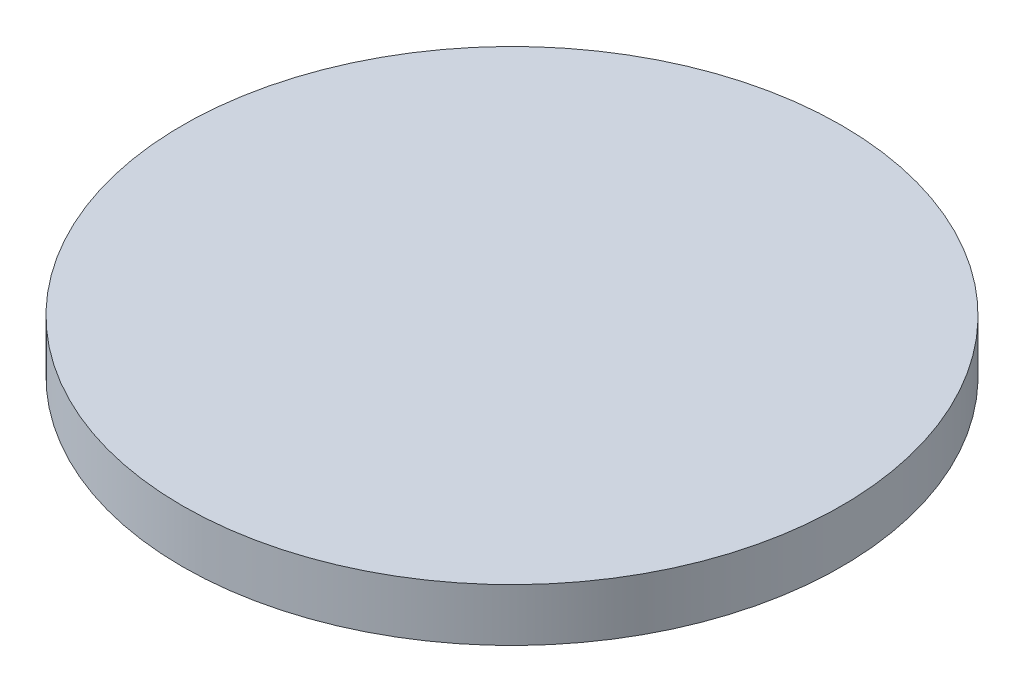
ISO-10303-21;
HEADER;
FILE_DESCRIPTION(('STEP AP214'),'2;1');
FILE_NAME('part.step','',(''),(''),'','','');
FILE_SCHEMA(('AUTOMOTIVE_DESIGN { 1 0 10303 214 1 1 1 1 }'));
ENDSEC;
DATA;
#1=APPLICATION_CONTEXT('core data for automotive mechanical design processes');
#2=APPLICATION_PROTOCOL_DEFINITION('international standard','automotive_design',2000,#1);
#3=PRODUCT_CONTEXT('',#1,'mechanical');
#4=PRODUCT('Part','Part','',(#3));
#5=PRODUCT_RELATED_PRODUCT_CATEGORY('part','',(#4));
#6=PRODUCT_DEFINITION_FORMATION('','',#4);
#7=PRODUCT_DEFINITION_CONTEXT('part definition',#1,'design');
#8=PRODUCT_DEFINITION('design','',#6,#7);
#9=PRODUCT_DEFINITION_SHAPE('','',#8);
#10=(LENGTH_UNIT() NAMED_UNIT(*) SI_UNIT(.MILLI.,.METRE.));
#11=(NAMED_UNIT(*) PLANE_ANGLE_UNIT() SI_UNIT($,.RADIAN.));
#12=(NAMED_UNIT(*) SI_UNIT($,.STERADIAN.) SOLID_ANGLE_UNIT());
#13=UNCERTAINTY_MEASURE_WITH_UNIT(LENGTH_MEASURE(1.E-05),#10,'distance_accuracy_value','');
#14=(GEOMETRIC_REPRESENTATION_CONTEXT(3) GLOBAL_UNCERTAINTY_ASSIGNED_CONTEXT((#13)) GLOBAL_UNIT_ASSIGNED_CONTEXT((#10,
#11,#12)) REPRESENTATION_CONTEXT('',''));
#15=CARTESIAN_POINT('',(0.,0.,0.));
#16=DIRECTION('',(0.,0.,1.));
#17=DIRECTION('',(1.,0.,0.));
#18=AXIS2_PLACEMENT_3D('',#15,#16,#17);
#19=CARTESIAN_POINT('',(0.,1.,0.));
#20=DIRECTION('',(0.,-1.,0.));
#21=DIRECTION('',(0.,0.,-1.));
#22=AXIS2_PLACEMENT_3D('',#19,#20,#21);
#23=CYLINDRICAL_SURFACE('',#22,6.25);
#24=CARTESIAN_POINT('',(0.,1.,0.));
#25=DIRECTION('',(0.,1.,0.));
#26=DIRECTION('',(0.,0.,1.));
#27=AXIS2_PLACEMENT_3D('',#24,#25,#26);
#28=CIRCLE('',#27,6.25);
#29=CARTESIAN_POINT('',(0.,1.,6.25));
#30=VERTEX_POINT('',#29);
#31=EDGE_CURVE('E10',#30,#30,#28,.T.);
#32=ORIENTED_EDGE('',*,*,#31,.F.);
#33=EDGE_LOOP('',(#32));
#34=FACE_BOUND('',#33,.T.);
#35=CARTESIAN_POINT('',(0.,0.,0.));
#36=DIRECTION('',(0.,1.,0.));
#37=DIRECTION('',(0.,0.,1.));
#38=AXIS2_PLACEMENT_3D('',#35,#36,#37);
#39=CIRCLE('',#38,6.25);
#40=CARTESIAN_POINT('',(0.,0.,6.25));
#41=VERTEX_POINT('',#40);
#42=EDGE_CURVE('E34',#41,#41,#39,.T.);
#43=ORIENTED_EDGE('',*,*,#42,.T.);
#44=EDGE_LOOP('',(#43));
#45=FACE_BOUND('',#44,.T.);
#46=ADVANCED_FACE('F31',(#34,#45),#23,.T.);
#47=CARTESIAN_POINT('',(0.,1.,0.));
#48=DIRECTION('',(0.,1.,0.));
#49=DIRECTION('',(0.,0.,1.));
#50=AXIS2_PLACEMENT_3D('',#47,#48,#49);
#51=PLANE('',#50);
#52=ORIENTED_EDGE('',*,*,#31,.T.);
#53=EDGE_LOOP('',(#52));
#54=FACE_BOUND('',#53,.T.);
#55=ADVANCED_FACE('F46',(#54),#51,.T.);
#56=CARTESIAN_POINT('',(0.,0.,0.));
#57=DIRECTION('',(0.,1.,0.));
#58=DIRECTION('',(0.,0.,1.));
#59=AXIS2_PLACEMENT_3D('',#56,#57,#58);
#60=PLANE('',#59);
#61=ORIENTED_EDGE('',*,*,#42,.F.);
#62=EDGE_LOOP('',(#61));
#63=FACE_BOUND('',#62,.T.);
#64=ADVANCED_FACE('F44',(#63),#60,.F.);
#65=CLOSED_SHELL('',(#46,#55,#64));
#66=MANIFOLD_SOLID_BREP('B2',#65);
#67=ADVANCED_BREP_SHAPE_REPRESENTATION('',(#18,#66),#14);
#68=SHAPE_DEFINITION_REPRESENTATION(#9,#67);
ENDSEC;
END-ISO-10303-21;
